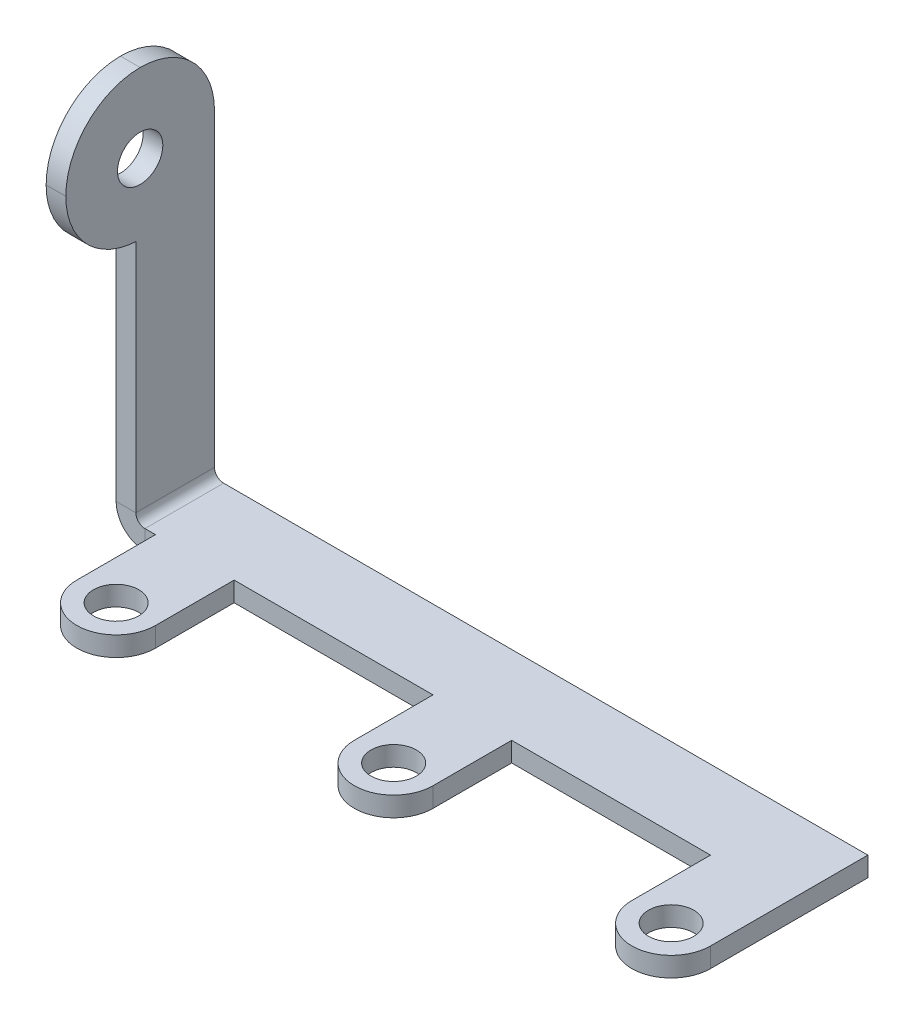
ISO-10303-21;
HEADER;
FILE_DESCRIPTION(('STEP AP214'),'2;1');
FILE_NAME('part.step','',(''),(''),'','','');
FILE_SCHEMA(('AUTOMOTIVE_DESIGN { 1 0 10303 214 1 1 1 1 }'));
ENDSEC;
DATA;
#1=APPLICATION_CONTEXT('core data for automotive mechanical design processes');
#2=APPLICATION_PROTOCOL_DEFINITION('international standard','automotive_design',2000,#1);
#3=PRODUCT_CONTEXT('',#1,'mechanical');
#4=PRODUCT('Part','Part','',(#3));
#5=PRODUCT_RELATED_PRODUCT_CATEGORY('part','',(#4));
#6=PRODUCT_DEFINITION_FORMATION('','',#4);
#7=PRODUCT_DEFINITION_CONTEXT('part definition',#1,'design');
#8=PRODUCT_DEFINITION('design','',#6,#7);
#9=PRODUCT_DEFINITION_SHAPE('','',#8);
#10=(LENGTH_UNIT() NAMED_UNIT(*) SI_UNIT(.MILLI.,.METRE.));
#11=(NAMED_UNIT(*) PLANE_ANGLE_UNIT() SI_UNIT($,.RADIAN.));
#12=(NAMED_UNIT(*) SI_UNIT($,.STERADIAN.) SOLID_ANGLE_UNIT());
#13=UNCERTAINTY_MEASURE_WITH_UNIT(LENGTH_MEASURE(1.E-05),#10,'distance_accuracy_value','');
#14=(GEOMETRIC_REPRESENTATION_CONTEXT(3) GLOBAL_UNCERTAINTY_ASSIGNED_CONTEXT((#13)) GLOBAL_UNIT_ASSIGNED_CONTEXT((#10,
#11,#12)) REPRESENTATION_CONTEXT('',''));
#15=CARTESIAN_POINT('',(0.,0.,0.));
#16=DIRECTION('',(0.,0.,1.));
#17=DIRECTION('',(1.,0.,0.));
#18=AXIS2_PLACEMENT_3D('',#15,#16,#17);
#19=CARTESIAN_POINT('',(-22.4,1.5875,0.));
#20=DIRECTION('',(0.,-1.,0.));
#21=DIRECTION('',(0.,0.,-1.));
#22=AXIS2_PLACEMENT_3D('',#19,#20,#21);
#23=PLANE('',#22);
#24=CARTESIAN_POINT('',(-22.4,1.5875,0.));
#25=DIRECTION('',(0.,1.,0.));
#26=DIRECTION('',(0.,0.,1.));
#27=AXIS2_PLACEMENT_3D('',#24,#25,#26);
#28=CIRCLE('',#27,1.8288);
#29=CARTESIAN_POINT('',(-22.4,1.5875,1.8288));
#30=VERTEX_POINT('',#29);
#31=EDGE_CURVE('E249',#30,#30,#28,.T.);
#32=ORIENTED_EDGE('',*,*,#31,.F.);
#33=EDGE_LOOP('',(#32));
#34=FACE_BOUND('',#33,.T.);
#35=CARTESIAN_POINT('',(22.4,1.5875,0.));
#36=DIRECTION('',(0.,1.,0.));
#37=DIRECTION('',(0.,0.,1.));
#38=AXIS2_PLACEMENT_3D('',#35,#36,#37);
#39=CIRCLE('',#38,1.8288);
#40=CARTESIAN_POINT('',(22.4,1.5875,1.8288));
#41=VERTEX_POINT('',#40);
#42=EDGE_CURVE('E255',#41,#41,#39,.T.);
#43=ORIENTED_EDGE('',*,*,#42,.F.);
#44=EDGE_LOOP('',(#43));
#45=FACE_BOUND('',#44,.T.);
#46=CARTESIAN_POINT('',(0.,1.5875,0.));
#47=DIRECTION('',(0.,1.,0.));
#48=DIRECTION('',(0.,0.,1.));
#49=AXIS2_PLACEMENT_3D('',#46,#47,#48);
#50=CIRCLE('',#49,1.8288);
#51=CARTESIAN_POINT('',(0.,1.5875,1.8288));
#52=VERTEX_POINT('',#51);
#53=EDGE_CURVE('E261',#52,#52,#50,.T.);
#54=ORIENTED_EDGE('',*,*,#53,.F.);
#55=EDGE_LOOP('',(#54));
#56=FACE_BOUND('',#55,.T.);
#57=DIRECTION('',(0.,0.,1.));
#58=VECTOR('',#57,1.);
#59=CARTESIAN_POINT('',(-26.4259,1.5875,-6.35));
#60=LINE('',#59,#58);
#61=CARTESIAN_POINT('',(-26.4259,1.5875,-6.35));
#62=VERTEX_POINT('',#61);
#63=CARTESIAN_POINT('',(-26.4259,1.5875,-12.7));
#64=VERTEX_POINT('',#63);
#65=EDGE_CURVE('E239',#62,#64,#60,.F.);
#66=ORIENTED_EDGE('',*,*,#65,.F.);
#67=DIRECTION('',(1.,0.,0.));
#68=VECTOR('',#67,1.);
#69=CARTESIAN_POINT('',(-25.575,1.5875,-6.35));
#70=LINE('',#69,#68);
#71=CARTESIAN_POINT('',(-25.575,1.5875,-6.35));
#72=VERTEX_POINT('',#71);
#73=EDGE_CURVE('E267',#62,#72,#70,.T.);
#74=ORIENTED_EDGE('',*,*,#73,.T.);
#75=DIRECTION('',(0.,0.,1.));
#76=VECTOR('',#75,1.);
#77=CARTESIAN_POINT('',(-25.575,1.5875,0.));
#78=LINE('',#77,#76);
#79=CARTESIAN_POINT('',(-25.575,1.5875,0.));
#80=VERTEX_POINT('',#79);
#81=EDGE_CURVE('E269',#72,#80,#78,.T.);
#82=ORIENTED_EDGE('',*,*,#81,.T.);
#83=CARTESIAN_POINT('',(-22.4,1.5875,0.));
#84=DIRECTION('',(0.,1.,0.));
#85=DIRECTION('',(0.,0.,-1.));
#86=AXIS2_PLACEMENT_3D('',#83,#84,#85);
#87=CIRCLE('',#86,3.175);
#88=CARTESIAN_POINT('',(-19.225,1.5875,0.));
#89=VERTEX_POINT('',#88);
#90=EDGE_CURVE('E272',#80,#89,#87,.T.);
#91=ORIENTED_EDGE('',*,*,#90,.T.);
#92=DIRECTION('',(0.,0.,-1.));
#93=VECTOR('',#92,1.);
#94=CARTESIAN_POINT('',(-19.225,1.5875,-6.35));
#95=LINE('',#94,#93);
#96=CARTESIAN_POINT('',(-19.225,1.5875,-6.35));
#97=VERTEX_POINT('',#96);
#98=EDGE_CURVE('E274',#89,#97,#95,.T.);
#99=ORIENTED_EDGE('',*,*,#98,.T.);
#100=DIRECTION('',(1.,0.,0.));
#101=VECTOR('',#100,1.);
#102=CARTESIAN_POINT('',(-3.175,1.5875,-6.35));
#103=LINE('',#102,#101);
#104=CARTESIAN_POINT('',(-3.175,1.5875,-6.35));
#105=VERTEX_POINT('',#104);
#106=EDGE_CURVE('E276',#97,#105,#103,.T.);
#107=ORIENTED_EDGE('',*,*,#106,.T.);
#108=DIRECTION('',(0.,0.,1.));
#109=VECTOR('',#108,1.);
#110=CARTESIAN_POINT('',(-3.175,1.5875,0.));
#111=LINE('',#110,#109);
#112=CARTESIAN_POINT('',(-3.175,1.5875,0.));
#113=VERTEX_POINT('',#112);
#114=EDGE_CURVE('E278',#105,#113,#111,.T.);
#115=ORIENTED_EDGE('',*,*,#114,.T.);
#116=CARTESIAN_POINT('',(0.,1.5875,0.));
#117=DIRECTION('',(0.,1.,0.));
#118=DIRECTION('',(0.,0.,-1.));
#119=AXIS2_PLACEMENT_3D('',#116,#117,#118);
#120=CIRCLE('',#119,3.175);
#121=CARTESIAN_POINT('',(3.175,1.5875,0.));
#122=VERTEX_POINT('',#121);
#123=EDGE_CURVE('E280',#113,#122,#120,.T.);
#124=ORIENTED_EDGE('',*,*,#123,.T.);
#125=DIRECTION('',(0.,0.,-1.));
#126=VECTOR('',#125,1.);
#127=CARTESIAN_POINT('',(3.175,1.5875,-6.35));
#128=LINE('',#127,#126);
#129=CARTESIAN_POINT('',(3.175,1.5875,-6.35));
#130=VERTEX_POINT('',#129);
#131=EDGE_CURVE('E282',#122,#130,#128,.T.);
#132=ORIENTED_EDGE('',*,*,#131,.T.);
#133=DIRECTION('',(1.,0.,0.));
#134=VECTOR('',#133,1.);
#135=CARTESIAN_POINT('',(19.225,1.5875,-6.35));
#136=LINE('',#135,#134);
#137=CARTESIAN_POINT('',(19.225,1.5875,-6.35));
#138=VERTEX_POINT('',#137);
#139=EDGE_CURVE('E284',#130,#138,#136,.T.);
#140=ORIENTED_EDGE('',*,*,#139,.T.);
#141=DIRECTION('',(0.,0.,1.));
#142=VECTOR('',#141,1.);
#143=CARTESIAN_POINT('',(19.225,1.5875,0.));
#144=LINE('',#143,#142);
#145=CARTESIAN_POINT('',(19.225,1.5875,0.));
#146=VERTEX_POINT('',#145);
#147=EDGE_CURVE('E286',#138,#146,#144,.T.);
#148=ORIENTED_EDGE('',*,*,#147,.T.);
#149=CARTESIAN_POINT('',(22.4,1.5875,0.));
#150=DIRECTION('',(0.,1.,0.));
#151=DIRECTION('',(0.,0.,-1.));
#152=AXIS2_PLACEMENT_3D('',#149,#150,#151);
#153=CIRCLE('',#152,3.175);
#154=CARTESIAN_POINT('',(25.575,1.5875,0.));
#155=VERTEX_POINT('',#154);
#156=EDGE_CURVE('E288',#146,#155,#153,.T.);
#157=ORIENTED_EDGE('',*,*,#156,.T.);
#158=DIRECTION('',(0.,0.,-1.));
#159=VECTOR('',#158,1.);
#160=CARTESIAN_POINT('',(25.575,1.5875,-12.7));
#161=LINE('',#160,#159);
#162=CARTESIAN_POINT('',(25.575,1.5875,-12.7));
#163=VERTEX_POINT('',#162);
#164=EDGE_CURVE('E290',#155,#163,#161,.T.);
#165=ORIENTED_EDGE('',*,*,#164,.T.);
#166=DIRECTION('',(-1.,0.,0.));
#167=VECTOR('',#166,1.);
#168=CARTESIAN_POINT('',(0.,1.5875,-12.7));
#169=LINE('',#168,#167);
#170=EDGE_CURVE('E292',#163,#64,#169,.T.);
#171=ORIENTED_EDGE('',*,*,#170,.T.);
#172=EDGE_LOOP('',(#66,#74,#82,#91,#99,#107,#115,#124,#132,#140,#148,#157,#165,#171));
#173=FACE_BOUND('',#172,.T.);
#174=ADVANCED_FACE('F39',(#34,#45,#56,#173),#23,.F.);
#175=CARTESIAN_POINT('',(-22.4,0.,0.));
#176=DIRECTION('',(0.,-1.,0.));
#177=DIRECTION('',(0.,0.,-1.));
#178=AXIS2_PLACEMENT_3D('',#175,#176,#177);
#179=PLANE('',#178);
#180=CARTESIAN_POINT('',(22.4,0.,0.));
#181=DIRECTION('',(0.,1.,0.));
#182=DIRECTION('',(0.,0.,1.));
#183=AXIS2_PLACEMENT_3D('',#180,#181,#182);
#184=CIRCLE('',#183,1.8288);
#185=CARTESIAN_POINT('',(22.4,0.,1.8288));
#186=VERTEX_POINT('',#185);
#187=EDGE_CURVE('E252',#186,#186,#184,.T.);
#188=ORIENTED_EDGE('',*,*,#187,.T.);
#189=EDGE_LOOP('',(#188));
#190=FACE_BOUND('',#189,.T.);
#191=CARTESIAN_POINT('',(0.,0.,0.));
#192=DIRECTION('',(0.,1.,0.));
#193=DIRECTION('',(0.,0.,1.));
#194=AXIS2_PLACEMENT_3D('',#191,#192,#193);
#195=CIRCLE('',#194,1.8288);
#196=CARTESIAN_POINT('',(0.,0.,1.8288));
#197=VERTEX_POINT('',#196);
#198=EDGE_CURVE('E258',#197,#197,#195,.T.);
#199=ORIENTED_EDGE('',*,*,#198,.T.);
#200=EDGE_LOOP('',(#199));
#201=FACE_BOUND('',#200,.T.);
#202=CARTESIAN_POINT('',(-22.4,0.,0.));
#203=DIRECTION('',(0.,1.,0.));
#204=DIRECTION('',(0.,0.,1.));
#205=AXIS2_PLACEMENT_3D('',#202,#203,#204);
#206=CIRCLE('',#205,1.8288);
#207=CARTESIAN_POINT('',(-22.4,0.,1.8288));
#208=VERTEX_POINT('',#207);
#209=EDGE_CURVE('E246',#208,#208,#206,.T.);
#210=ORIENTED_EDGE('',*,*,#209,.T.);
#211=EDGE_LOOP('',(#210));
#212=FACE_BOUND('',#211,.T.);
#213=DIRECTION('',(1.,0.,0.));
#214=VECTOR('',#213,1.);
#215=CARTESIAN_POINT('',(-25.575,0.,-6.35));
#216=LINE('',#215,#214);
#217=CARTESIAN_POINT('',(-26.4259,0.,-6.35));
#218=VERTEX_POINT('',#217);
#219=CARTESIAN_POINT('',(-25.575,0.,-6.35));
#220=VERTEX_POINT('',#219);
#221=EDGE_CURVE('E264',#218,#220,#216,.T.);
#222=ORIENTED_EDGE('',*,*,#221,.F.);
#223=DIRECTION('',(0.,0.,1.));
#224=VECTOR('',#223,1.);
#225=CARTESIAN_POINT('',(-26.4259,0.,-6.35));
#226=LINE('',#225,#224);
#227=CARTESIAN_POINT('',(-26.4259,0.,-12.7));
#228=VERTEX_POINT('',#227);
#229=EDGE_CURVE('E226',#218,#228,#226,.F.);
#230=ORIENTED_EDGE('',*,*,#229,.T.);
#231=DIRECTION('',(-1.,0.,0.));
#232=VECTOR('',#231,1.);
#233=CARTESIAN_POINT('',(0.,0.,-12.7));
#234=LINE('',#233,#232);
#235=CARTESIAN_POINT('',(25.575,0.,-12.7));
#236=VERTEX_POINT('',#235);
#237=EDGE_CURVE('E270',#236,#228,#234,.T.);
#238=ORIENTED_EDGE('',*,*,#237,.F.);
#239=DIRECTION('',(0.,0.,-1.));
#240=VECTOR('',#239,1.);
#241=CARTESIAN_POINT('',(25.575,0.,-12.7));
#242=LINE('',#241,#240);
#243=CARTESIAN_POINT('',(25.575,0.,0.));
#244=VERTEX_POINT('',#243);
#245=EDGE_CURVE('E317',#244,#236,#242,.T.);
#246=ORIENTED_EDGE('',*,*,#245,.F.);
#247=CARTESIAN_POINT('',(22.4,0.,0.));
#248=DIRECTION('',(0.,1.,0.));
#249=DIRECTION('',(0.,0.,-1.));
#250=AXIS2_PLACEMENT_3D('',#247,#248,#249);
#251=CIRCLE('',#250,3.175);
#252=CARTESIAN_POINT('',(19.225,0.,0.));
#253=VERTEX_POINT('',#252);
#254=EDGE_CURVE('E315',#253,#244,#251,.T.);
#255=ORIENTED_EDGE('',*,*,#254,.F.);
#256=DIRECTION('',(0.,0.,1.));
#257=VECTOR('',#256,1.);
#258=CARTESIAN_POINT('',(19.225,0.,0.));
#259=LINE('',#258,#257);
#260=CARTESIAN_POINT('',(19.225,0.,-6.35));
#261=VERTEX_POINT('',#260);
#262=EDGE_CURVE('E313',#261,#253,#259,.T.);
#263=ORIENTED_EDGE('',*,*,#262,.F.);
#264=DIRECTION('',(1.,0.,0.));
#265=VECTOR('',#264,1.);
#266=CARTESIAN_POINT('',(19.225,0.,-6.35));
#267=LINE('',#266,#265);
#268=CARTESIAN_POINT('',(3.175,0.,-6.35));
#269=VERTEX_POINT('',#268);
#270=EDGE_CURVE('E311',#269,#261,#267,.T.);
#271=ORIENTED_EDGE('',*,*,#270,.F.);
#272=DIRECTION('',(0.,0.,-1.));
#273=VECTOR('',#272,1.);
#274=CARTESIAN_POINT('',(3.175,0.,-6.35));
#275=LINE('',#274,#273);
#276=CARTESIAN_POINT('',(3.175,0.,0.));
#277=VERTEX_POINT('',#276);
#278=EDGE_CURVE('E309',#277,#269,#275,.T.);
#279=ORIENTED_EDGE('',*,*,#278,.F.);
#280=CARTESIAN_POINT('',(0.,0.,0.));
#281=DIRECTION('',(0.,1.,0.));
#282=DIRECTION('',(0.,0.,-1.));
#283=AXIS2_PLACEMENT_3D('',#280,#281,#282);
#284=CIRCLE('',#283,3.175);
#285=CARTESIAN_POINT('',(-3.175,0.,0.));
#286=VERTEX_POINT('',#285);
#287=EDGE_CURVE('E307',#286,#277,#284,.T.);
#288=ORIENTED_EDGE('',*,*,#287,.F.);
#289=DIRECTION('',(0.,0.,1.));
#290=VECTOR('',#289,1.);
#291=CARTESIAN_POINT('',(-3.175,0.,0.));
#292=LINE('',#291,#290);
#293=CARTESIAN_POINT('',(-3.175,0.,-6.35));
#294=VERTEX_POINT('',#293);
#295=EDGE_CURVE('E305',#294,#286,#292,.T.);
#296=ORIENTED_EDGE('',*,*,#295,.F.);
#297=DIRECTION('',(1.,0.,0.));
#298=VECTOR('',#297,1.);
#299=CARTESIAN_POINT('',(-3.175,0.,-6.35));
#300=LINE('',#299,#298);
#301=CARTESIAN_POINT('',(-19.225,0.,-6.35));
#302=VERTEX_POINT('',#301);
#303=EDGE_CURVE('E303',#302,#294,#300,.T.);
#304=ORIENTED_EDGE('',*,*,#303,.F.);
#305=DIRECTION('',(0.,0.,-1.));
#306=VECTOR('',#305,1.);
#307=CARTESIAN_POINT('',(-19.225,0.,-6.35));
#308=LINE('',#307,#306);
#309=CARTESIAN_POINT('',(-19.225,0.,0.));
#310=VERTEX_POINT('',#309);
#311=EDGE_CURVE('E301',#310,#302,#308,.T.);
#312=ORIENTED_EDGE('',*,*,#311,.F.);
#313=CARTESIAN_POINT('',(-22.4,0.,0.));
#314=DIRECTION('',(0.,1.,0.));
#315=DIRECTION('',(0.,0.,-1.));
#316=AXIS2_PLACEMENT_3D('',#313,#314,#315);
#317=CIRCLE('',#316,3.175);
#318=CARTESIAN_POINT('',(-25.575,0.,0.));
#319=VERTEX_POINT('',#318);
#320=EDGE_CURVE('E299',#319,#310,#317,.T.);
#321=ORIENTED_EDGE('',*,*,#320,.F.);
#322=DIRECTION('',(0.,0.,1.));
#323=VECTOR('',#322,1.);
#324=CARTESIAN_POINT('',(-25.575,0.,0.));
#325=LINE('',#324,#323);
#326=EDGE_CURVE('E297',#220,#319,#325,.T.);
#327=ORIENTED_EDGE('',*,*,#326,.F.);
#328=EDGE_LOOP('',(#222,#230,#238,#246,#255,#263,#271,#279,#288,#296,#304,#312,#321,#327));
#329=FACE_BOUND('',#328,.T.);
#330=ADVANCED_FACE('F403',(#190,#201,#212,#329),#179,.T.);
#331=CARTESIAN_POINT('',(-25.575,1.5875,-6.35));
#332=DIRECTION('',(0.,0.,-1.));
#333=DIRECTION('',(-1.,0.,0.));
#334=AXIS2_PLACEMENT_3D('',#331,#332,#333);
#335=PLANE('',#334);
#336=DIRECTION('',(0.,-1.,0.));
#337=VECTOR('',#336,1.);
#338=CARTESIAN_POINT('',(-26.4259,1.5875,-6.35));
#339=LINE('',#338,#337);
#340=EDGE_CURVE('E233',#62,#218,#339,.T.);
#341=ORIENTED_EDGE('',*,*,#340,.T.);
#342=ORIENTED_EDGE('',*,*,#221,.T.);
#343=DIRECTION('',(0.,-1.,0.));
#344=VECTOR('',#343,1.);
#345=CARTESIAN_POINT('',(-25.575,1.5875,-6.35));
#346=LINE('',#345,#344);
#347=EDGE_CURVE('E354',#72,#220,#346,.T.);
#348=ORIENTED_EDGE('',*,*,#347,.F.);
#349=ORIENTED_EDGE('',*,*,#73,.F.);
#350=EDGE_LOOP('',(#341,#342,#348,#349));
#351=FACE_BOUND('',#350,.T.);
#352=ADVANCED_FACE('F409',(#351),#335,.F.);
#353=CARTESIAN_POINT('',(0.,1.5875,-12.7));
#354=DIRECTION('',(0.,0.,1.));
#355=DIRECTION('',(1.,0.,0.));
#356=AXIS2_PLACEMENT_3D('',#353,#354,#355);
#357=PLANE('',#356);
#358=DIRECTION('',(0.,-1.,0.));
#359=VECTOR('',#358,1.);
#360=CARTESIAN_POINT('',(-26.4259,1.5875,-12.7));
#361=LINE('',#360,#359);
#362=EDGE_CURVE('E243',#64,#228,#361,.T.);
#363=ORIENTED_EDGE('',*,*,#362,.F.);
#364=ORIENTED_EDGE('',*,*,#170,.F.);
#365=DIRECTION('',(0.,-1.,0.));
#366=VECTOR('',#365,1.);
#367=CARTESIAN_POINT('',(25.575,1.5875,-12.7));
#368=LINE('',#367,#366);
#369=EDGE_CURVE('E295',#163,#236,#368,.T.);
#370=ORIENTED_EDGE('',*,*,#369,.T.);
#371=ORIENTED_EDGE('',*,*,#237,.T.);
#372=EDGE_LOOP('',(#363,#364,#370,#371));
#373=FACE_BOUND('',#372,.T.);
#374=ADVANCED_FACE('F418',(#373),#357,.F.);
#375=CARTESIAN_POINT('',(-25.575,1.5875,0.));
#376=DIRECTION('',(1.,0.,0.));
#377=DIRECTION('',(0.,0.,-1.));
#378=AXIS2_PLACEMENT_3D('',#375,#376,#377);
#379=PLANE('',#378);
#380=ORIENTED_EDGE('',*,*,#326,.T.);
#381=DIRECTION('',(0.,-1.,0.));
#382=VECTOR('',#381,1.);
#383=CARTESIAN_POINT('',(-25.575,1.5875,0.));
#384=LINE('',#383,#382);
#385=EDGE_CURVE('E351',#80,#319,#384,.T.);
#386=ORIENTED_EDGE('',*,*,#385,.F.);
#387=ORIENTED_EDGE('',*,*,#81,.F.);
#388=ORIENTED_EDGE('',*,*,#347,.T.);
#389=EDGE_LOOP('',(#380,#386,#387,#388));
#390=FACE_BOUND('',#389,.T.);
#391=ADVANCED_FACE('F421',(#390),#379,.F.);
#392=CARTESIAN_POINT('',(-22.4,1.5875,0.));
#393=DIRECTION('',(0.,-1.,0.));
#394=DIRECTION('',(0.,0.,-1.));
#395=AXIS2_PLACEMENT_3D('',#392,#393,#394);
#396=CYLINDRICAL_SURFACE('',#395,3.175);
#397=ORIENTED_EDGE('',*,*,#320,.T.);
#398=DIRECTION('',(0.,-1.,0.));
#399=VECTOR('',#398,1.);
#400=CARTESIAN_POINT('',(-19.225,1.5875,0.));
#401=LINE('',#400,#399);
#402=EDGE_CURVE('E348',#89,#310,#401,.T.);
#403=ORIENTED_EDGE('',*,*,#402,.F.);
#404=ORIENTED_EDGE('',*,*,#90,.F.);
#405=ORIENTED_EDGE('',*,*,#385,.T.);
#406=EDGE_LOOP('',(#397,#403,#404,#405));
#407=FACE_BOUND('',#406,.T.);
#408=ADVANCED_FACE('F458',(#407),#396,.T.);
#409=CARTESIAN_POINT('',(-19.225,1.5875,-6.35));
#410=DIRECTION('',(-1.,0.,0.));
#411=DIRECTION('',(0.,0.,1.));
#412=AXIS2_PLACEMENT_3D('',#409,#410,#411);
#413=PLANE('',#412);
#414=ORIENTED_EDGE('',*,*,#311,.T.);
#415=DIRECTION('',(0.,-1.,0.));
#416=VECTOR('',#415,1.);
#417=CARTESIAN_POINT('',(-19.225,1.5875,-6.35));
#418=LINE('',#417,#416);
#419=EDGE_CURVE('E345',#97,#302,#418,.T.);
#420=ORIENTED_EDGE('',*,*,#419,.F.);
#421=ORIENTED_EDGE('',*,*,#98,.F.);
#422=ORIENTED_EDGE('',*,*,#402,.T.);
#423=EDGE_LOOP('',(#414,#420,#421,#422));
#424=FACE_BOUND('',#423,.T.);
#425=ADVANCED_FACE('F454',(#424),#413,.F.);
#426=CARTESIAN_POINT('',(-3.175,1.5875,-6.35));
#427=DIRECTION('',(0.,0.,-1.));
#428=DIRECTION('',(-1.,0.,0.));
#429=AXIS2_PLACEMENT_3D('',#426,#427,#428);
#430=PLANE('',#429);
#431=ORIENTED_EDGE('',*,*,#303,.T.);
#432=DIRECTION('',(0.,-1.,0.));
#433=VECTOR('',#432,1.);
#434=CARTESIAN_POINT('',(-3.175,1.5875,-6.35));
#435=LINE('',#434,#433);
#436=EDGE_CURVE('E342',#105,#294,#435,.T.);
#437=ORIENTED_EDGE('',*,*,#436,.F.);
#438=ORIENTED_EDGE('',*,*,#106,.F.);
#439=ORIENTED_EDGE('',*,*,#419,.T.);
#440=EDGE_LOOP('',(#431,#437,#438,#439));
#441=FACE_BOUND('',#440,.T.);
#442=ADVANCED_FACE('F450',(#441),#430,.F.);
#443=CARTESIAN_POINT('',(-3.175,1.5875,0.));
#444=DIRECTION('',(1.,0.,0.));
#445=DIRECTION('',(0.,0.,-1.));
#446=AXIS2_PLACEMENT_3D('',#443,#444,#445);
#447=PLANE('',#446);
#448=ORIENTED_EDGE('',*,*,#295,.T.);
#449=DIRECTION('',(0.,-1.,0.));
#450=VECTOR('',#449,1.);
#451=CARTESIAN_POINT('',(-3.175,1.5875,0.));
#452=LINE('',#451,#450);
#453=EDGE_CURVE('E339',#113,#286,#452,.T.);
#454=ORIENTED_EDGE('',*,*,#453,.F.);
#455=ORIENTED_EDGE('',*,*,#114,.F.);
#456=ORIENTED_EDGE('',*,*,#436,.T.);
#457=EDGE_LOOP('',(#448,#454,#455,#456));
#458=FACE_BOUND('',#457,.T.);
#459=ADVANCED_FACE('F446',(#458),#447,.F.);
#460=CARTESIAN_POINT('',(0.,1.5875,0.));
#461=DIRECTION('',(0.,-1.,0.));
#462=DIRECTION('',(0.,0.,-1.));
#463=AXIS2_PLACEMENT_3D('',#460,#461,#462);
#464=CYLINDRICAL_SURFACE('',#463,3.175);
#465=ORIENTED_EDGE('',*,*,#287,.T.);
#466=DIRECTION('',(0.,-1.,0.));
#467=VECTOR('',#466,1.);
#468=CARTESIAN_POINT('',(3.175,1.5875,0.));
#469=LINE('',#468,#467);
#470=EDGE_CURVE('E336',#122,#277,#469,.T.);
#471=ORIENTED_EDGE('',*,*,#470,.F.);
#472=ORIENTED_EDGE('',*,*,#123,.F.);
#473=ORIENTED_EDGE('',*,*,#453,.T.);
#474=EDGE_LOOP('',(#465,#471,#472,#473));
#475=FACE_BOUND('',#474,.T.);
#476=ADVANCED_FACE('F442',(#475),#464,.T.);
#477=CARTESIAN_POINT('',(3.175,1.5875,-6.35));
#478=DIRECTION('',(-1.,0.,0.));
#479=DIRECTION('',(0.,0.,1.));
#480=AXIS2_PLACEMENT_3D('',#477,#478,#479);
#481=PLANE('',#480);
#482=ORIENTED_EDGE('',*,*,#278,.T.);
#483=DIRECTION('',(0.,-1.,0.));
#484=VECTOR('',#483,1.);
#485=CARTESIAN_POINT('',(3.175,1.5875,-6.35));
#486=LINE('',#485,#484);
#487=EDGE_CURVE('E333',#130,#269,#486,.T.);
#488=ORIENTED_EDGE('',*,*,#487,.F.);
#489=ORIENTED_EDGE('',*,*,#131,.F.);
#490=ORIENTED_EDGE('',*,*,#470,.T.);
#491=EDGE_LOOP('',(#482,#488,#489,#490));
#492=FACE_BOUND('',#491,.T.);
#493=ADVANCED_FACE('F438',(#492),#481,.F.);
#494=CARTESIAN_POINT('',(19.225,1.5875,-6.35));
#495=DIRECTION('',(0.,0.,-1.));
#496=DIRECTION('',(-1.,0.,0.));
#497=AXIS2_PLACEMENT_3D('',#494,#495,#496);
#498=PLANE('',#497);
#499=ORIENTED_EDGE('',*,*,#270,.T.);
#500=DIRECTION('',(0.,-1.,0.));
#501=VECTOR('',#500,1.);
#502=CARTESIAN_POINT('',(19.225,1.5875,-6.35));
#503=LINE('',#502,#501);
#504=EDGE_CURVE('E330',#138,#261,#503,.T.);
#505=ORIENTED_EDGE('',*,*,#504,.F.);
#506=ORIENTED_EDGE('',*,*,#139,.F.);
#507=ORIENTED_EDGE('',*,*,#487,.T.);
#508=EDGE_LOOP('',(#499,#505,#506,#507));
#509=FACE_BOUND('',#508,.T.);
#510=ADVANCED_FACE('F434',(#509),#498,.F.);
#511=CARTESIAN_POINT('',(19.225,1.5875,0.));
#512=DIRECTION('',(1.,0.,0.));
#513=DIRECTION('',(0.,0.,-1.));
#514=AXIS2_PLACEMENT_3D('',#511,#512,#513);
#515=PLANE('',#514);
#516=ORIENTED_EDGE('',*,*,#262,.T.);
#517=DIRECTION('',(0.,-1.,0.));
#518=VECTOR('',#517,1.);
#519=CARTESIAN_POINT('',(19.225,1.5875,0.));
#520=LINE('',#519,#518);
#521=EDGE_CURVE('E327',#146,#253,#520,.T.);
#522=ORIENTED_EDGE('',*,*,#521,.F.);
#523=ORIENTED_EDGE('',*,*,#147,.F.);
#524=ORIENTED_EDGE('',*,*,#504,.T.);
#525=EDGE_LOOP('',(#516,#522,#523,#524));
#526=FACE_BOUND('',#525,.T.);
#527=ADVANCED_FACE('F430',(#526),#515,.F.);
#528=CARTESIAN_POINT('',(22.4,1.5875,0.));
#529=DIRECTION('',(0.,-1.,0.));
#530=DIRECTION('',(0.,0.,-1.));
#531=AXIS2_PLACEMENT_3D('',#528,#529,#530);
#532=CYLINDRICAL_SURFACE('',#531,3.175);
#533=ORIENTED_EDGE('',*,*,#254,.T.);
#534=DIRECTION('',(0.,-1.,0.));
#535=VECTOR('',#534,1.);
#536=CARTESIAN_POINT('',(25.575,1.5875,0.));
#537=LINE('',#536,#535);
#538=EDGE_CURVE('E324',#155,#244,#537,.T.);
#539=ORIENTED_EDGE('',*,*,#538,.F.);
#540=ORIENTED_EDGE('',*,*,#156,.F.);
#541=ORIENTED_EDGE('',*,*,#521,.T.);
#542=EDGE_LOOP('',(#533,#539,#540,#541));
#543=FACE_BOUND('',#542,.T.);
#544=ADVANCED_FACE('F426',(#543),#532,.T.);
#545=CARTESIAN_POINT('',(25.575,1.5875,-12.7));
#546=DIRECTION('',(-1.,0.,0.));
#547=DIRECTION('',(0.,0.,1.));
#548=AXIS2_PLACEMENT_3D('',#545,#546,#547);
#549=PLANE('',#548);
#550=ORIENTED_EDGE('',*,*,#245,.T.);
#551=ORIENTED_EDGE('',*,*,#369,.F.);
#552=ORIENTED_EDGE('',*,*,#164,.F.);
#553=ORIENTED_EDGE('',*,*,#538,.T.);
#554=EDGE_LOOP('',(#550,#551,#552,#553));
#555=FACE_BOUND('',#554,.T.);
#556=ADVANCED_FACE('F423',(#555),#549,.F.);
#557=CARTESIAN_POINT('',(0.,1.5875,0.));
#558=DIRECTION('',(0.,-1.,0.));
#559=DIRECTION('',(0.,0.,-1.));
#560=AXIS2_PLACEMENT_3D('',#557,#558,#559);
#561=CYLINDRICAL_SURFACE('',#560,1.8288);
#562=ORIENTED_EDGE('',*,*,#53,.T.);
#563=EDGE_LOOP('',(#562));
#564=FACE_BOUND('',#563,.T.);
#565=ORIENTED_EDGE('',*,*,#198,.F.);
#566=EDGE_LOOP('',(#565));
#567=FACE_BOUND('',#566,.T.);
#568=ADVANCED_FACE('F415',(#564,#567),#561,.F.);
#569=CARTESIAN_POINT('',(22.4,1.5875,0.));
#570=DIRECTION('',(0.,-1.,0.));
#571=DIRECTION('',(0.,0.,-1.));
#572=AXIS2_PLACEMENT_3D('',#569,#570,#571);
#573=CYLINDRICAL_SURFACE('',#572,1.8288);
#574=ORIENTED_EDGE('',*,*,#42,.T.);
#575=EDGE_LOOP('',(#574));
#576=FACE_BOUND('',#575,.T.);
#577=ORIENTED_EDGE('',*,*,#187,.F.);
#578=EDGE_LOOP('',(#577));
#579=FACE_BOUND('',#578,.T.);
#580=ADVANCED_FACE('F560',(#576,#579),#573,.F.);
#581=CARTESIAN_POINT('',(-22.4,1.5875,0.));
#582=DIRECTION('',(0.,-1.,0.));
#583=DIRECTION('',(0.,0.,-1.));
#584=AXIS2_PLACEMENT_3D('',#581,#582,#583);
#585=CYLINDRICAL_SURFACE('',#584,1.8288);
#586=ORIENTED_EDGE('',*,*,#31,.T.);
#587=EDGE_LOOP('',(#586));
#588=FACE_BOUND('',#587,.T.);
#589=ORIENTED_EDGE('',*,*,#209,.F.);
#590=EDGE_LOOP('',(#589));
#591=FACE_BOUND('',#590,.T.);
#592=ADVANCED_FACE('F551',(#588,#591),#585,.F.);
#593=CARTESIAN_POINT('',(-26.4259,2.3241,-12.7));
#594=DIRECTION('',(0.,0.,-1.));
#595=DIRECTION('',(-1.,0.,0.));
#596=AXIS2_PLACEMENT_3D('',#593,#594,#595);
#597=PLANE('',#596);
#598=DIRECTION('',(-1.,0.,0.));
#599=VECTOR('',#598,1.);
#600=CARTESIAN_POINT('',(-27.1625,2.3241,-12.7));
#601=LINE('',#600,#599);
#602=CARTESIAN_POINT('',(-27.1625,2.3241,-12.7));
#603=VERTEX_POINT('',#602);
#604=CARTESIAN_POINT('',(-28.75,2.32409999999999,-12.7));
#605=VERTEX_POINT('',#604);
#606=EDGE_CURVE('E207',#603,#605,#601,.T.);
#607=ORIENTED_EDGE('',*,*,#606,.F.);
#608=CARTESIAN_POINT('',(-26.4259,2.3241,-12.7));
#609=DIRECTION('',(0.,0.,1.));
#610=DIRECTION('',(1.,0.,0.));
#611=AXIS2_PLACEMENT_3D('',#608,#609,#610);
#612=CIRCLE('',#611,0.7366);
#613=EDGE_CURVE('E236',#64,#603,#612,.F.);
#614=ORIENTED_EDGE('',*,*,#613,.F.);
#615=ORIENTED_EDGE('',*,*,#362,.T.);
#616=CARTESIAN_POINT('',(-26.4259,2.3241,-12.7));
#617=DIRECTION('',(0.,0.,1.));
#618=DIRECTION('',(1.,0.,0.));
#619=AXIS2_PLACEMENT_3D('',#616,#617,#618);
#620=CIRCLE('',#619,2.3241);
#621=EDGE_CURVE('E229',#228,#605,#620,.F.);
#622=ORIENTED_EDGE('',*,*,#621,.T.);
#623=EDGE_LOOP('',(#607,#614,#615,#622));
#624=FACE_BOUND('',#623,.T.);
#625=ADVANCED_FACE('F543',(#624),#597,.T.);
#626=CARTESIAN_POINT('',(-26.4259,2.3241,-6.35));
#627=DIRECTION('',(0.,0.,-1.));
#628=DIRECTION('',(-1.,0.,0.));
#629=AXIS2_PLACEMENT_3D('',#626,#627,#628);
#630=PLANE('',#629);
#631=CARTESIAN_POINT('',(-26.4259,2.3241,-6.35));
#632=DIRECTION('',(0.,0.,1.));
#633=DIRECTION('',(1.,0.,0.));
#634=AXIS2_PLACEMENT_3D('',#631,#632,#633);
#635=CIRCLE('',#634,0.7366);
#636=CARTESIAN_POINT('',(-27.1625,2.3241,-6.35));
#637=VERTEX_POINT('',#636);
#638=EDGE_CURVE('E223',#637,#62,#635,.T.);
#639=ORIENTED_EDGE('',*,*,#638,.F.);
#640=DIRECTION('',(-1.,0.,0.));
#641=VECTOR('',#640,1.);
#642=CARTESIAN_POINT('',(-27.1625,2.3241,-6.35));
#643=LINE('',#642,#641);
#644=CARTESIAN_POINT('',(-28.75,2.32409999999999,-6.35));
#645=VERTEX_POINT('',#644);
#646=EDGE_CURVE('E201',#637,#645,#643,.T.);
#647=ORIENTED_EDGE('',*,*,#646,.T.);
#648=CARTESIAN_POINT('',(-26.4259,2.3241,-6.35));
#649=DIRECTION('',(0.,0.,1.));
#650=DIRECTION('',(1.,0.,0.));
#651=AXIS2_PLACEMENT_3D('',#648,#649,#650);
#652=CIRCLE('',#651,2.3241);
#653=EDGE_CURVE('E230',#645,#218,#652,.T.);
#654=ORIENTED_EDGE('',*,*,#653,.T.);
#655=ORIENTED_EDGE('',*,*,#340,.F.);
#656=EDGE_LOOP('',(#639,#647,#654,#655));
#657=FACE_BOUND('',#656,.T.);
#658=ADVANCED_FACE('F535',(#657),#630,.F.);
#659=CARTESIAN_POINT('',(-26.4259,2.3241,-6.35));
#660=DIRECTION('',(0.,0.,1.));
#661=DIRECTION('',(-1.,0.,0.));
#662=AXIS2_PLACEMENT_3D('',#659,#660,#661);
#663=CYLINDRICAL_SURFACE('',#662,2.3241);
#664=ORIENTED_EDGE('',*,*,#229,.F.);
#665=ORIENTED_EDGE('',*,*,#653,.F.);
#666=DIRECTION('',(0.,0.,-1.));
#667=VECTOR('',#666,1.);
#668=CARTESIAN_POINT('',(-28.75,2.32409999999999,0.));
#669=LINE('',#668,#667);
#670=EDGE_CURVE('E203',#645,#605,#669,.T.);
#671=ORIENTED_EDGE('',*,*,#670,.T.);
#672=ORIENTED_EDGE('',*,*,#621,.F.);
#673=EDGE_LOOP('',(#664,#665,#671,#672));
#674=FACE_BOUND('',#673,.T.);
#675=ADVANCED_FACE('F528',(#674),#663,.T.);
#676=CARTESIAN_POINT('',(-26.4259,2.3241,-6.35));
#677=DIRECTION('',(0.,0.,1.));
#678=DIRECTION('',(-1.,0.,0.));
#679=AXIS2_PLACEMENT_3D('',#676,#677,#678);
#680=CYLINDRICAL_SURFACE('',#679,0.7366);
#681=ORIENTED_EDGE('',*,*,#65,.T.);
#682=ORIENTED_EDGE('',*,*,#613,.T.);
#683=DIRECTION('',(0.,0.,1.));
#684=VECTOR('',#683,1.);
#685=CARTESIAN_POINT('',(-27.1625,2.3241,-12.7));
#686=LINE('',#685,#684);
#687=EDGE_CURVE('E210',#603,#637,#686,.T.);
#688=ORIENTED_EDGE('',*,*,#687,.T.);
#689=ORIENTED_EDGE('',*,*,#638,.T.);
#690=EDGE_LOOP('',(#681,#682,#688,#689));
#691=FACE_BOUND('',#690,.T.);
#692=ADVANCED_FACE('F518',(#691),#680,.F.);
#693=CARTESIAN_POINT('',(-28.7500000000001,33.2755,-6.35));
#694=DIRECTION('',(0.,0.,-1.));
#695=DIRECTION('',(0.,1.,0.));
#696=AXIS2_PLACEMENT_3D('',#693,#694,#695);
#697=PLANE('',#696);
#698=DIRECTION('',(0.,1.,0.));
#699=VECTOR('',#698,1.);
#700=CARTESIAN_POINT('',(-27.1625000000001,33.2755,-6.35));
#701=LINE('',#700,#699);
#702=CARTESIAN_POINT('',(-27.1625000000001,21.2755,-6.35));
#703=VERTEX_POINT('',#702);
#704=EDGE_CURVE('E185',#637,#703,#701,.T.);
#705=ORIENTED_EDGE('',*,*,#704,.T.);
#706=DIRECTION('',(-1.,0.,0.));
#707=VECTOR('',#706,1.);
#708=CARTESIAN_POINT('',(-27.1625000000001,21.2755,-6.35));
#709=LINE('',#708,#707);
#710=CARTESIAN_POINT('',(-28.7500000000001,21.2755,-6.35));
#711=VERTEX_POINT('',#710);
#712=EDGE_CURVE('E198',#703,#711,#709,.T.);
#713=ORIENTED_EDGE('',*,*,#712,.T.);
#714=DIRECTION('',(0.,1.,0.));
#715=VECTOR('',#714,1.);
#716=CARTESIAN_POINT('',(-28.7500000000001,33.2755,-6.35));
#717=LINE('',#716,#715);
#718=EDGE_CURVE('E220',#645,#711,#717,.T.);
#719=ORIENTED_EDGE('',*,*,#718,.F.);
#720=ORIENTED_EDGE('',*,*,#646,.F.);
#721=EDGE_LOOP('',(#705,#713,#719,#720));
#722=FACE_BOUND('',#721,.T.);
#723=ADVANCED_FACE('F196',(#722),#697,.F.);
#724=CARTESIAN_POINT('',(-28.75,1.58749999999999,-12.7));
#725=DIRECTION('',(0.,0.,1.));
#726=DIRECTION('',(1.,0.,0.));
#727=AXIS2_PLACEMENT_3D('',#724,#725,#726);
#728=PLANE('',#727);
#729=DIRECTION('',(0.,-1.,0.));
#730=VECTOR('',#729,1.);
#731=CARTESIAN_POINT('',(-28.75,1.58749999999999,-12.7));
#732=LINE('',#731,#730);
#733=CARTESIAN_POINT('',(-28.7500000000001,27.2755,-12.7));
#734=VERTEX_POINT('',#733);
#735=EDGE_CURVE('E222',#734,#605,#732,.T.);
#736=ORIENTED_EDGE('',*,*,#735,.F.);
#737=DIRECTION('',(1.,0.,0.));
#738=VECTOR('',#737,1.);
#739=CARTESIAN_POINT('',(-28.7500000000001,27.2755,-12.7));
#740=LINE('',#739,#738);
#741=CARTESIAN_POINT('',(-27.1625000000001,27.2755,-12.7));
#742=VERTEX_POINT('',#741);
#743=EDGE_CURVE('E11',#734,#742,#740,.T.);
#744=ORIENTED_EDGE('',*,*,#743,.T.);
#745=DIRECTION('',(0.,-1.,0.));
#746=VECTOR('',#745,1.);
#747=CARTESIAN_POINT('',(-27.1625,1.5875,-12.7));
#748=LINE('',#747,#746);
#749=EDGE_CURVE('E202',#742,#603,#748,.T.);
#750=ORIENTED_EDGE('',*,*,#749,.T.);
#751=ORIENTED_EDGE('',*,*,#606,.T.);
#752=EDGE_LOOP('',(#736,#744,#750,#751));
#753=FACE_BOUND('',#752,.T.);
#754=ADVANCED_FACE('F392',(#753),#728,.F.);
#755=CARTESIAN_POINT('',(-28.75,-1.00709455060092E-13,0.));
#756=DIRECTION('',(1.,0.,0.));
#757=DIRECTION('',(0.,1.,0.));
#758=AXIS2_PLACEMENT_3D('',#755,#756,#757);
#759=PLANE('',#758);
#760=CARTESIAN_POINT('',(-28.7500000000001,26.9255,-6.70000000000106));
#761=DIRECTION('',(-1.,0.,0.));
#762=DIRECTION('',(0.,-1.,0.));
#763=AXIS2_PLACEMENT_3D('',#760,#761,#762);
#764=CIRCLE('',#763,1.82880000000002);
#765=CARTESIAN_POINT('',(-28.7500000000001,25.0967,-6.70000000000106));
#766=VERTEX_POINT('',#765);
#767=EDGE_CURVE('E361',#766,#766,#764,.T.);
#768=ORIENTED_EDGE('',*,*,#767,.F.);
#769=EDGE_LOOP('',(#768));
#770=FACE_BOUND('',#769,.T.);
#771=ORIENTED_EDGE('',*,*,#718,.T.);
#772=CARTESIAN_POINT('',(-28.7500000000001,27.2652829676876,-6.69999999999999));
#773=DIRECTION('',(1.,0.,0.));
#774=DIRECTION('',(0.,1.,0.));
#775=AXIS2_PLACEMENT_3D('',#772,#773,#774);
#776=CIRCLE('',#775,6.);
#777=CARTESIAN_POINT('',(-28.7500000000001,27.2652829676876,-0.699999999999993));
#778=VERTEX_POINT('',#777);
#779=EDGE_CURVE('E206',#711,#778,#776,.F.);
#780=ORIENTED_EDGE('',*,*,#779,.T.);
#781=DIRECTION('',(0.,1.,0.));
#782=VECTOR('',#781,1.);
#783=CARTESIAN_POINT('',(-28.7500000000001,33.2755,-0.699999999999994));
#784=LINE('',#783,#782);
#785=CARTESIAN_POINT('',(-28.7500000000001,27.2755,-0.699999999999993));
#786=VERTEX_POINT('',#785);
#787=EDGE_CURVE('E212',#778,#786,#784,.T.);
#788=ORIENTED_EDGE('',*,*,#787,.T.);
#789=CARTESIAN_POINT('',(-28.7500000000001,27.2755,-6.69999999999999));
#790=DIRECTION('',(1.,0.,0.));
#791=DIRECTION('',(0.,1.,0.));
#792=AXIS2_PLACEMENT_3D('',#789,#790,#791);
#793=CIRCLE('',#792,6.);
#794=CARTESIAN_POINT('',(-28.7500000000001,33.2755,-6.69999999999999));
#795=VERTEX_POINT('',#794);
#796=EDGE_CURVE('E363',#786,#795,#793,.F.);
#797=ORIENTED_EDGE('',*,*,#796,.T.);
#798=CARTESIAN_POINT('',(-28.7500000000001,27.2755,-6.69999999999999));
#799=DIRECTION('',(1.,0.,0.));
#800=DIRECTION('',(0.,1.,0.));
#801=AXIS2_PLACEMENT_3D('',#798,#799,#800);
#802=CIRCLE('',#801,6.);
#803=EDGE_CURVE('E357',#795,#734,#802,.F.);
#804=ORIENTED_EDGE('',*,*,#803,.T.);
#805=ORIENTED_EDGE('',*,*,#735,.T.);
#806=ORIENTED_EDGE('',*,*,#670,.F.);
#807=EDGE_LOOP('',(#771,#780,#788,#797,#804,#805,#806));
#808=FACE_BOUND('',#807,.T.);
#809=ADVANCED_FACE('F383',(#770,#808),#759,.F.);
#810=CARTESIAN_POINT('',(-27.1625,0.,0.));
#811=DIRECTION('',(1.,0.,0.));
#812=DIRECTION('',(0.,1.,0.));
#813=AXIS2_PLACEMENT_3D('',#810,#811,#812);
#814=PLANE('',#813);
#815=CARTESIAN_POINT('',(-27.1625000000001,26.9255,-6.70000000000106));
#816=DIRECTION('',(1.,0.,0.));
#817=DIRECTION('',(0.,1.,0.));
#818=AXIS2_PLACEMENT_3D('',#815,#816,#817);
#819=CIRCLE('',#818,1.82880000000002);
#820=CARTESIAN_POINT('',(-27.1625000000001,28.7543,-6.70000000000106));
#821=VERTEX_POINT('',#820);
#822=EDGE_CURVE('E358',#821,#821,#819,.T.);
#823=ORIENTED_EDGE('',*,*,#822,.F.);
#824=EDGE_LOOP('',(#823));
#825=FACE_BOUND('',#824,.T.);
#826=DIRECTION('',(0.,1.,0.));
#827=VECTOR('',#826,1.);
#828=CARTESIAN_POINT('',(-27.1625000000001,33.2755,-0.699999999999994));
#829=LINE('',#828,#827);
#830=CARTESIAN_POINT('',(-27.1625000000001,27.2652829676876,-0.699999999999993));
#831=VERTEX_POINT('',#830);
#832=CARTESIAN_POINT('',(-27.1625000000001,27.2755,-0.699999999999993));
#833=VERTEX_POINT('',#832);
#834=EDGE_CURVE('E187',#831,#833,#829,.T.);
#835=ORIENTED_EDGE('',*,*,#834,.F.);
#836=CARTESIAN_POINT('',(-27.1625000000001,27.2652829676876,-6.69999999999999));
#837=DIRECTION('',(1.,0.,0.));
#838=DIRECTION('',(0.,1.,0.));
#839=AXIS2_PLACEMENT_3D('',#836,#837,#838);
#840=CIRCLE('',#839,6.);
#841=EDGE_CURVE('E48',#831,#703,#840,.T.);
#842=ORIENTED_EDGE('',*,*,#841,.T.);
#843=ORIENTED_EDGE('',*,*,#704,.F.);
#844=ORIENTED_EDGE('',*,*,#687,.F.);
#845=ORIENTED_EDGE('',*,*,#749,.F.);
#846=CARTESIAN_POINT('',(-27.1625000000001,27.2755,-6.69999999999999));
#847=DIRECTION('',(1.,0.,0.));
#848=DIRECTION('',(0.,1.,0.));
#849=AXIS2_PLACEMENT_3D('',#846,#847,#848);
#850=CIRCLE('',#849,6.);
#851=CARTESIAN_POINT('',(-27.1625000000001,33.2755,-6.69999999999999));
#852=VERTEX_POINT('',#851);
#853=EDGE_CURVE('E55',#742,#852,#850,.T.);
#854=ORIENTED_EDGE('',*,*,#853,.T.);
#855=CARTESIAN_POINT('',(-27.1625000000001,27.2755,-6.69999999999999));
#856=DIRECTION('',(1.,0.,0.));
#857=DIRECTION('',(0.,1.,0.));
#858=AXIS2_PLACEMENT_3D('',#855,#856,#857);
#859=CIRCLE('',#858,6.);
#860=EDGE_CURVE('E191',#852,#833,#859,.T.);
#861=ORIENTED_EDGE('',*,*,#860,.T.);
#862=EDGE_LOOP('',(#835,#842,#843,#844,#845,#854,#861));
#863=FACE_BOUND('',#862,.T.);
#864=ADVANCED_FACE('F183',(#825,#863),#814,.T.);
#865=CARTESIAN_POINT('',(-27.1625000000001,33.2755,-0.699999999999994));
#866=DIRECTION('',(0.,0.,1.));
#867=DIRECTION('',(0.,-1.,0.));
#868=AXIS2_PLACEMENT_3D('',#865,#866,#867);
#869=PLANE('',#868);
#870=ORIENTED_EDGE('',*,*,#787,.F.);
#871=DIRECTION('',(-1.,0.,0.));
#872=VECTOR('',#871,1.);
#873=CARTESIAN_POINT('',(-27.1625000000001,27.2652829676876,-0.699999999999993));
#874=LINE('',#873,#872);
#875=EDGE_CURVE('E369',#778,#831,#874,.F.);
#876=ORIENTED_EDGE('',*,*,#875,.T.);
#877=ORIENTED_EDGE('',*,*,#834,.T.);
#878=DIRECTION('',(-1.,0.,0.));
#879=VECTOR('',#878,1.);
#880=CARTESIAN_POINT('',(-28.7500000000001,27.2755,-0.699999999999993));
#881=LINE('',#880,#879);
#882=EDGE_CURVE('E366',#833,#786,#881,.T.);
#883=ORIENTED_EDGE('',*,*,#882,.T.);
#884=EDGE_LOOP('',(#870,#876,#877,#883));
#885=FACE_BOUND('',#884,.T.);
#886=ADVANCED_FACE('F378',(#885),#869,.T.);
#887=CARTESIAN_POINT('',(25.575,26.9255000000002,-6.70000000000106));
#888=DIRECTION('',(-1.,0.,0.));
#889=DIRECTION('',(0.,-1.,0.));
#890=AXIS2_PLACEMENT_3D('',#887,#888,#889);
#891=CYLINDRICAL_SURFACE('',#890,1.82880000000002);
#892=ORIENTED_EDGE('',*,*,#822,.T.);
#893=EDGE_LOOP('',(#892));
#894=FACE_BOUND('',#893,.T.);
#895=ORIENTED_EDGE('',*,*,#767,.T.);
#896=EDGE_LOOP('',(#895));
#897=FACE_BOUND('',#896,.T.);
#898=ADVANCED_FACE('F389',(#894,#897),#891,.F.);
#899=CARTESIAN_POINT('',(-27.1625000000001,27.2652829676876,-6.69999999999999));
#900=DIRECTION('',(1.,0.,0.));
#901=DIRECTION('',(0.,1.,0.));
#902=AXIS2_PLACEMENT_3D('',#899,#900,#901);
#903=CYLINDRICAL_SURFACE('',#902,6.);
#904=ORIENTED_EDGE('',*,*,#841,.F.);
#905=ORIENTED_EDGE('',*,*,#875,.F.);
#906=ORIENTED_EDGE('',*,*,#779,.F.);
#907=ORIENTED_EDGE('',*,*,#712,.F.);
#908=EDGE_LOOP('',(#904,#905,#906,#907));
#909=FACE_BOUND('',#908,.T.);
#910=ADVANCED_FACE('F205',(#909),#903,.T.);
#911=CARTESIAN_POINT('',(-28.7500000000001,27.2755,-6.69999999999999));
#912=DIRECTION('',(1.,0.,0.));
#913=DIRECTION('',(0.,1.,0.));
#914=AXIS2_PLACEMENT_3D('',#911,#912,#913);
#915=CYLINDRICAL_SURFACE('',#914,6.);
#916=DIRECTION('',(1.,0.,0.));
#917=VECTOR('',#916,1.);
#918=CARTESIAN_POINT('',(-28.7500000000001,33.2755,-6.69999999999999));
#919=LINE('',#918,#917);
#920=EDGE_CURVE('E43',#852,#795,#919,.F.);
#921=ORIENTED_EDGE('',*,*,#920,.F.);
#922=ORIENTED_EDGE('',*,*,#853,.F.);
#923=ORIENTED_EDGE('',*,*,#743,.F.);
#924=ORIENTED_EDGE('',*,*,#803,.F.);
#925=EDGE_LOOP('',(#921,#922,#923,#924));
#926=FACE_BOUND('',#925,.T.);
#927=ADVANCED_FACE('F41',(#926),#915,.T.);
#928=CARTESIAN_POINT('',(-27.1625000000001,27.2755,-6.69999999999999));
#929=DIRECTION('',(1.,0.,0.));
#930=DIRECTION('',(0.,1.,0.));
#931=AXIS2_PLACEMENT_3D('',#928,#929,#930);
#932=CYLINDRICAL_SURFACE('',#931,6.);
#933=ORIENTED_EDGE('',*,*,#860,.F.);
#934=ORIENTED_EDGE('',*,*,#920,.T.);
#935=ORIENTED_EDGE('',*,*,#796,.F.);
#936=ORIENTED_EDGE('',*,*,#882,.F.);
#937=EDGE_LOOP('',(#933,#934,#935,#936));
#938=FACE_BOUND('',#937,.T.);
#939=ADVANCED_FACE('F380',(#938),#932,.T.);
#940=CLOSED_SHELL('',(#174,#330,#352,#374,#391,#408,#425,#442,#459,#476,#493,#510,#527,#544,
#556,#568,#580,#592,#625,#658,#675,#692,#723,#754,#809,#864,#886,#898,#910,#927,#939));
#941=MANIFOLD_SOLID_BREP('B2',#940);
#942=ADVANCED_BREP_SHAPE_REPRESENTATION('',(#18,#941),#14);
#943=SHAPE_DEFINITION_REPRESENTATION(#9,#942);
ENDSEC;
END-ISO-10303-21;
